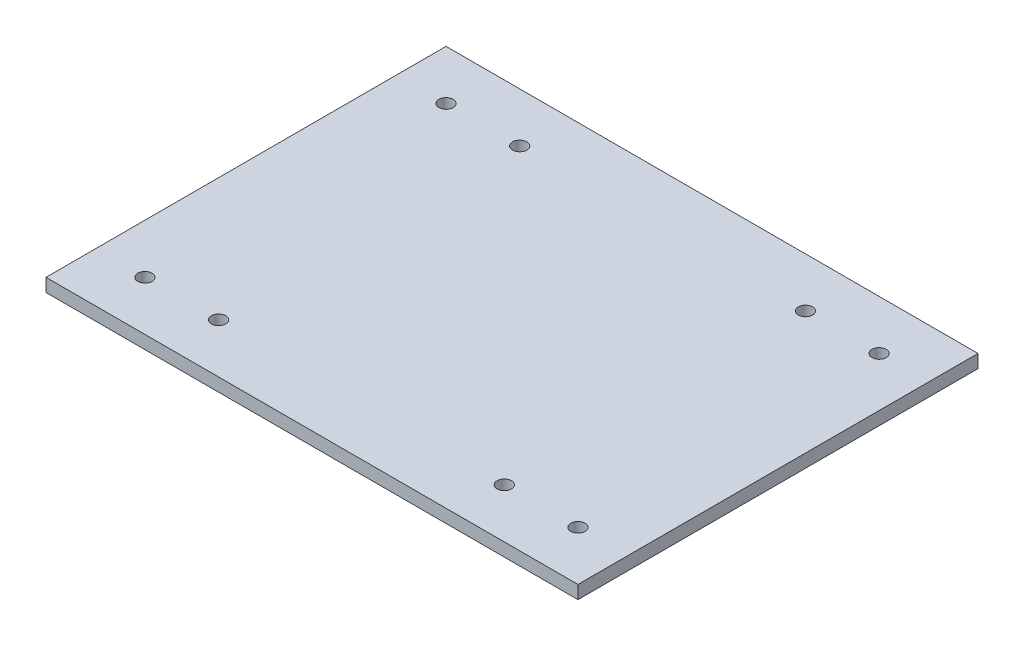
ISO-10303-21;
HEADER;
FILE_DESCRIPTION(('STEP AP214'),'2;1');
FILE_NAME('part.step','',(''),(''),'','','');
FILE_SCHEMA(('AUTOMOTIVE_DESIGN { 1 0 10303 214 1 1 1 1 }'));
ENDSEC;
DATA;
#1=APPLICATION_CONTEXT('core data for automotive mechanical design processes');
#2=APPLICATION_PROTOCOL_DEFINITION('international standard','automotive_design',2000,#1);
#3=PRODUCT_CONTEXT('',#1,'mechanical');
#4=PRODUCT('Part','Part','',(#3));
#5=PRODUCT_RELATED_PRODUCT_CATEGORY('part','',(#4));
#6=PRODUCT_DEFINITION_FORMATION('','',#4);
#7=PRODUCT_DEFINITION_CONTEXT('part definition',#1,'design');
#8=PRODUCT_DEFINITION('design','',#6,#7);
#9=PRODUCT_DEFINITION_SHAPE('','',#8);
#10=(LENGTH_UNIT() NAMED_UNIT(*) SI_UNIT(.MILLI.,.METRE.));
#11=(NAMED_UNIT(*) PLANE_ANGLE_UNIT() SI_UNIT($,.RADIAN.));
#12=(NAMED_UNIT(*) SI_UNIT($,.STERADIAN.) SOLID_ANGLE_UNIT());
#13=UNCERTAINTY_MEASURE_WITH_UNIT(LENGTH_MEASURE(1.E-05),#10,'distance_accuracy_value','');
#14=(GEOMETRIC_REPRESENTATION_CONTEXT(3) GLOBAL_UNCERTAINTY_ASSIGNED_CONTEXT((#13)) GLOBAL_UNIT_ASSIGNED_CONTEXT((#10,
#11,#12)) REPRESENTATION_CONTEXT('',''));
#15=CARTESIAN_POINT('',(0.,0.,0.));
#16=DIRECTION('',(0.,0.,1.));
#17=DIRECTION('',(1.,0.,0.));
#18=AXIS2_PLACEMENT_3D('',#15,#16,#17);
#19=CARTESIAN_POINT('',(0.,6.,0.));
#20=DIRECTION('',(0.,1.,0.));
#21=DIRECTION('',(0.,0.,1.));
#22=AXIS2_PLACEMENT_3D('',#19,#20,#21);
#23=PLANE('',#22);
#24=CARTESIAN_POINT('',(-56.,6.,-159.5));
#25=DIRECTION('',(0.,1.,0.));
#26=DIRECTION('',(0.,0.,1.));
#27=AXIS2_PLACEMENT_3D('',#24,#25,#26);
#28=CIRCLE('',#27,3.25);
#29=CARTESIAN_POINT('',(-56.,6.,-156.25));
#30=VERTEX_POINT('',#29);
#31=EDGE_CURVE('E192',#30,#30,#28,.T.);
#32=ORIENTED_EDGE('',*,*,#31,.F.);
#33=EDGE_LOOP('',(#32));
#34=FACE_BOUND('',#33,.T.);
#35=CARTESIAN_POINT('',(-56.,6.,-22.5));
#36=DIRECTION('',(0.,1.,0.));
#37=DIRECTION('',(0.,0.,1.));
#38=AXIS2_PLACEMENT_3D('',#35,#36,#37);
#39=CIRCLE('',#38,3.24999999999999);
#40=CARTESIAN_POINT('',(-56.,6.,-19.25));
#41=VERTEX_POINT('',#40);
#42=EDGE_CURVE('E176',#41,#41,#39,.T.);
#43=ORIENTED_EDGE('',*,*,#42,.F.);
#44=EDGE_LOOP('',(#43));
#45=FACE_BOUND('',#44,.T.);
#46=CARTESIAN_POINT('',(-219.5,6.,-22.5));
#47=DIRECTION('',(0.,1.,0.));
#48=DIRECTION('',(0.,0.,1.));
#49=AXIS2_PLACEMENT_3D('',#46,#47,#48);
#50=CIRCLE('',#49,3.25000000000001);
#51=CARTESIAN_POINT('',(-219.5,6.,-19.25));
#52=VERTEX_POINT('',#51);
#53=EDGE_CURVE('E133',#52,#52,#50,.T.);
#54=ORIENTED_EDGE('',*,*,#53,.F.);
#55=EDGE_LOOP('',(#54));
#56=FACE_BOUND('',#55,.T.);
#57=CARTESIAN_POINT('',(-219.5,6.,-159.5));
#58=DIRECTION('',(0.,1.,0.));
#59=DIRECTION('',(0.,0.,1.));
#60=AXIS2_PLACEMENT_3D('',#57,#58,#59);
#61=CIRCLE('',#60,3.25000000000001);
#62=CARTESIAN_POINT('',(-219.5,6.,-156.25));
#63=VERTEX_POINT('',#62);
#64=EDGE_CURVE('E134',#63,#63,#61,.T.);
#65=ORIENTED_EDGE('',*,*,#64,.F.);
#66=EDGE_LOOP('',(#65));
#67=FACE_BOUND('',#66,.T.);
#68=DIRECTION('',(0.,0.,-1.));
#69=VECTOR('',#68,1.);
#70=CARTESIAN_POINT('',(0.,6.,0.));
#71=LINE('',#70,#69);
#72=CARTESIAN_POINT('',(0.,6.,0.));
#73=VERTEX_POINT('',#72);
#74=CARTESIAN_POINT('',(0.,6.,-182.));
#75=VERTEX_POINT('',#74);
#76=EDGE_CURVE('E93',#73,#75,#71,.T.);
#77=ORIENTED_EDGE('',*,*,#76,.T.);
#78=DIRECTION('',(-1.,0.,0.));
#79=VECTOR('',#78,1.);
#80=CARTESIAN_POINT('',(0.,6.,-182.));
#81=LINE('',#80,#79);
#82=CARTESIAN_POINT('',(-242.,6.,-182.));
#83=VERTEX_POINT('',#82);
#84=EDGE_CURVE('E88',#75,#83,#81,.T.);
#85=ORIENTED_EDGE('',*,*,#84,.T.);
#86=DIRECTION('',(0.,0.,1.));
#87=VECTOR('',#86,1.);
#88=CARTESIAN_POINT('',(-242.,6.,0.));
#89=LINE('',#88,#87);
#90=CARTESIAN_POINT('',(-242.,6.,0.));
#91=VERTEX_POINT('',#90);
#92=EDGE_CURVE('E91',#83,#91,#89,.T.);
#93=ORIENTED_EDGE('',*,*,#92,.T.);
#94=DIRECTION('',(1.,0.,0.));
#95=VECTOR('',#94,1.);
#96=CARTESIAN_POINT('',(0.,6.,0.));
#97=LINE('',#96,#95);
#98=EDGE_CURVE('E58',#91,#73,#97,.T.);
#99=ORIENTED_EDGE('',*,*,#98,.T.);
#100=EDGE_LOOP('',(#77,#85,#93,#99));
#101=FACE_BOUND('',#100,.T.);
#102=CARTESIAN_POINT('',(-186.,6.,-159.5));
#103=DIRECTION('',(0.,1.,0.));
#104=DIRECTION('',(0.,0.,1.));
#105=AXIS2_PLACEMENT_3D('',#102,#103,#104);
#106=CIRCLE('',#105,3.25000000000001);
#107=CARTESIAN_POINT('',(-186.,6.,-156.25));
#108=VERTEX_POINT('',#107);
#109=EDGE_CURVE('E120',#108,#108,#106,.T.);
#110=ORIENTED_EDGE('',*,*,#109,.F.);
#111=EDGE_LOOP('',(#110));
#112=FACE_BOUND('',#111,.T.);
#113=CARTESIAN_POINT('',(-186.,6.,-22.5));
#114=DIRECTION('',(0.,1.,0.));
#115=DIRECTION('',(0.,0.,1.));
#116=AXIS2_PLACEMENT_3D('',#113,#114,#115);
#117=CIRCLE('',#116,3.25000000000001);
#118=CARTESIAN_POINT('',(-186.,6.,-19.25));
#119=VERTEX_POINT('',#118);
#120=EDGE_CURVE('E170',#119,#119,#117,.T.);
#121=ORIENTED_EDGE('',*,*,#120,.F.);
#122=EDGE_LOOP('',(#121));
#123=FACE_BOUND('',#122,.T.);
#124=CARTESIAN_POINT('',(-22.5,6.,-22.5));
#125=DIRECTION('',(0.,1.,0.));
#126=DIRECTION('',(0.,0.,1.));
#127=AXIS2_PLACEMENT_3D('',#124,#125,#126);
#128=CIRCLE('',#127,3.25);
#129=CARTESIAN_POINT('',(-22.5,6.,-19.25));
#130=VERTEX_POINT('',#129);
#131=EDGE_CURVE('E184',#130,#130,#128,.T.);
#132=ORIENTED_EDGE('',*,*,#131,.F.);
#133=EDGE_LOOP('',(#132));
#134=FACE_BOUND('',#133,.T.);
#135=CARTESIAN_POINT('',(-22.5,6.,-159.5));
#136=DIRECTION('',(0.,1.,0.));
#137=DIRECTION('',(0.,0.,1.));
#138=AXIS2_PLACEMENT_3D('',#135,#136,#137);
#139=CIRCLE('',#138,3.25);
#140=CARTESIAN_POINT('',(-22.5,6.,-156.25));
#141=VERTEX_POINT('',#140);
#142=EDGE_CURVE('E200',#141,#141,#139,.T.);
#143=ORIENTED_EDGE('',*,*,#142,.F.);
#144=EDGE_LOOP('',(#143));
#145=FACE_BOUND('',#144,.T.);
#146=ADVANCED_FACE('F40',(#34,#45,#56,#67,#101,#112,#123,#134,#145),#23,.T.);
#147=CARTESIAN_POINT('',(0.,0.,0.));
#148=DIRECTION('',(0.,1.,0.));
#149=DIRECTION('',(0.,0.,1.));
#150=AXIS2_PLACEMENT_3D('',#147,#148,#149);
#151=PLANE('',#150);
#152=DIRECTION('',(0.,0.,-1.));
#153=VECTOR('',#152,1.);
#154=CARTESIAN_POINT('',(0.,0.,0.));
#155=LINE('',#154,#153);
#156=CARTESIAN_POINT('',(0.,0.,0.));
#157=VERTEX_POINT('',#156);
#158=CARTESIAN_POINT('',(0.,0.,-182.));
#159=VERTEX_POINT('',#158);
#160=EDGE_CURVE('E139',#157,#159,#155,.T.);
#161=ORIENTED_EDGE('',*,*,#160,.F.);
#162=DIRECTION('',(1.,0.,0.));
#163=VECTOR('',#162,1.);
#164=CARTESIAN_POINT('',(0.,0.,0.));
#165=LINE('',#164,#163);
#166=CARTESIAN_POINT('',(-242.,0.,0.));
#167=VERTEX_POINT('',#166);
#168=EDGE_CURVE('E81',#167,#157,#165,.T.);
#169=ORIENTED_EDGE('',*,*,#168,.F.);
#170=DIRECTION('',(0.,0.,1.));
#171=VECTOR('',#170,1.);
#172=CARTESIAN_POINT('',(-242.,0.,0.));
#173=LINE('',#172,#171);
#174=CARTESIAN_POINT('',(-242.,0.,-182.));
#175=VERTEX_POINT('',#174);
#176=EDGE_CURVE('E75',#175,#167,#173,.T.);
#177=ORIENTED_EDGE('',*,*,#176,.F.);
#178=DIRECTION('',(-1.,0.,0.));
#179=VECTOR('',#178,1.);
#180=CARTESIAN_POINT('',(0.,0.,-182.));
#181=LINE('',#180,#179);
#182=EDGE_CURVE('E98',#159,#175,#181,.T.);
#183=ORIENTED_EDGE('',*,*,#182,.F.);
#184=EDGE_LOOP('',(#161,#169,#177,#183));
#185=FACE_BOUND('',#184,.T.);
#186=CARTESIAN_POINT('',(-219.5,0.,-159.5));
#187=DIRECTION('',(0.,1.,0.));
#188=DIRECTION('',(0.,0.,1.));
#189=AXIS2_PLACEMENT_3D('',#186,#187,#188);
#190=CIRCLE('',#189,3.25000000000001);
#191=CARTESIAN_POINT('',(-219.5,0.,-156.25));
#192=VERTEX_POINT('',#191);
#193=EDGE_CURVE('E126',#192,#192,#190,.T.);
#194=ORIENTED_EDGE('',*,*,#193,.T.);
#195=EDGE_LOOP('',(#194));
#196=FACE_BOUND('',#195,.T.);
#197=CARTESIAN_POINT('',(-186.,0.,-159.5));
#198=DIRECTION('',(0.,1.,0.));
#199=DIRECTION('',(0.,0.,1.));
#200=AXIS2_PLACEMENT_3D('',#197,#198,#199);
#201=CIRCLE('',#200,3.25000000000001);
#202=CARTESIAN_POINT('',(-186.,0.,-156.25));
#203=VERTEX_POINT('',#202);
#204=EDGE_CURVE('E127',#203,#203,#201,.T.);
#205=ORIENTED_EDGE('',*,*,#204,.T.);
#206=EDGE_LOOP('',(#205));
#207=FACE_BOUND('',#206,.T.);
#208=CARTESIAN_POINT('',(-219.5,0.,-22.5));
#209=DIRECTION('',(0.,1.,0.));
#210=DIRECTION('',(0.,0.,1.));
#211=AXIS2_PLACEMENT_3D('',#208,#209,#210);
#212=CIRCLE('',#211,3.25000000000001);
#213=CARTESIAN_POINT('',(-219.5,0.,-19.25));
#214=VERTEX_POINT('',#213);
#215=EDGE_CURVE('E128',#214,#214,#212,.T.);
#216=ORIENTED_EDGE('',*,*,#215,.T.);
#217=EDGE_LOOP('',(#216));
#218=FACE_BOUND('',#217,.T.);
#219=CARTESIAN_POINT('',(-186.,0.,-22.5));
#220=DIRECTION('',(0.,1.,0.));
#221=DIRECTION('',(0.,0.,1.));
#222=AXIS2_PLACEMENT_3D('',#219,#220,#221);
#223=CIRCLE('',#222,3.25000000000001);
#224=CARTESIAN_POINT('',(-186.,0.,-19.25));
#225=VERTEX_POINT('',#224);
#226=EDGE_CURVE('E173',#225,#225,#223,.T.);
#227=ORIENTED_EDGE('',*,*,#226,.T.);
#228=EDGE_LOOP('',(#227));
#229=FACE_BOUND('',#228,.T.);
#230=CARTESIAN_POINT('',(-56.,0.,-22.5));
#231=DIRECTION('',(0.,1.,0.));
#232=DIRECTION('',(0.,0.,1.));
#233=AXIS2_PLACEMENT_3D('',#230,#231,#232);
#234=CIRCLE('',#233,3.24999999999999);
#235=CARTESIAN_POINT('',(-56.,0.,-19.25));
#236=VERTEX_POINT('',#235);
#237=EDGE_CURVE('E180',#236,#236,#234,.T.);
#238=ORIENTED_EDGE('',*,*,#237,.T.);
#239=EDGE_LOOP('',(#238));
#240=FACE_BOUND('',#239,.T.);
#241=CARTESIAN_POINT('',(-22.5,0.,-22.5));
#242=DIRECTION('',(0.,1.,0.));
#243=DIRECTION('',(0.,0.,1.));
#244=AXIS2_PLACEMENT_3D('',#241,#242,#243);
#245=CIRCLE('',#244,3.25);
#246=CARTESIAN_POINT('',(-22.5,0.,-19.25));
#247=VERTEX_POINT('',#246);
#248=EDGE_CURVE('E188',#247,#247,#245,.T.);
#249=ORIENTED_EDGE('',*,*,#248,.T.);
#250=EDGE_LOOP('',(#249));
#251=FACE_BOUND('',#250,.T.);
#252=CARTESIAN_POINT('',(-56.,0.,-159.5));
#253=DIRECTION('',(0.,1.,0.));
#254=DIRECTION('',(0.,0.,1.));
#255=AXIS2_PLACEMENT_3D('',#252,#253,#254);
#256=CIRCLE('',#255,3.25);
#257=CARTESIAN_POINT('',(-56.,0.,-156.25));
#258=VERTEX_POINT('',#257);
#259=EDGE_CURVE('E196',#258,#258,#256,.T.);
#260=ORIENTED_EDGE('',*,*,#259,.T.);
#261=EDGE_LOOP('',(#260));
#262=FACE_BOUND('',#261,.T.);
#263=CARTESIAN_POINT('',(-22.5,0.,-159.5));
#264=DIRECTION('',(0.,1.,0.));
#265=DIRECTION('',(0.,0.,1.));
#266=AXIS2_PLACEMENT_3D('',#263,#264,#265);
#267=CIRCLE('',#266,3.25);
#268=CARTESIAN_POINT('',(-22.5,0.,-156.25));
#269=VERTEX_POINT('',#268);
#270=EDGE_CURVE('E204',#269,#269,#267,.T.);
#271=ORIENTED_EDGE('',*,*,#270,.T.);
#272=EDGE_LOOP('',(#271));
#273=FACE_BOUND('',#272,.T.);
#274=ADVANCED_FACE('F157',(#185,#196,#207,#218,#229,#240,#251,#262,#273),#151,.F.);
#275=CARTESIAN_POINT('',(0.,6.,0.));
#276=DIRECTION('',(-1.,0.,0.));
#277=DIRECTION('',(0.,0.,1.));
#278=AXIS2_PLACEMENT_3D('',#275,#276,#277);
#279=PLANE('',#278);
#280=ORIENTED_EDGE('',*,*,#160,.T.);
#281=DIRECTION('',(0.,-1.,0.));
#282=VECTOR('',#281,1.);
#283=CARTESIAN_POINT('',(0.,6.,-182.));
#284=LINE('',#283,#282);
#285=EDGE_CURVE('E12',#75,#159,#284,.T.);
#286=ORIENTED_EDGE('',*,*,#285,.F.);
#287=ORIENTED_EDGE('',*,*,#76,.F.);
#288=DIRECTION('',(0.,-1.,0.));
#289=VECTOR('',#288,1.);
#290=CARTESIAN_POINT('',(0.,6.,0.));
#291=LINE('',#290,#289);
#292=EDGE_CURVE('E105',#73,#157,#291,.T.);
#293=ORIENTED_EDGE('',*,*,#292,.T.);
#294=EDGE_LOOP('',(#280,#286,#287,#293));
#295=FACE_BOUND('',#294,.T.);
#296=ADVANCED_FACE('F42',(#295),#279,.F.);
#297=CARTESIAN_POINT('',(0.,6.,-182.));
#298=DIRECTION('',(0.,0.,1.));
#299=DIRECTION('',(1.,0.,0.));
#300=AXIS2_PLACEMENT_3D('',#297,#298,#299);
#301=PLANE('',#300);
#302=ORIENTED_EDGE('',*,*,#182,.T.);
#303=DIRECTION('',(0.,-1.,0.));
#304=VECTOR('',#303,1.);
#305=CARTESIAN_POINT('',(-242.,6.,-182.));
#306=LINE('',#305,#304);
#307=EDGE_CURVE('E50',#83,#175,#306,.T.);
#308=ORIENTED_EDGE('',*,*,#307,.F.);
#309=ORIENTED_EDGE('',*,*,#84,.F.);
#310=ORIENTED_EDGE('',*,*,#285,.T.);
#311=EDGE_LOOP('',(#302,#308,#309,#310));
#312=FACE_BOUND('',#311,.T.);
#313=ADVANCED_FACE('F97',(#312),#301,.F.);
#314=CARTESIAN_POINT('',(-242.,6.,0.));
#315=DIRECTION('',(1.,0.,0.));
#316=DIRECTION('',(0.,0.,-1.));
#317=AXIS2_PLACEMENT_3D('',#314,#315,#316);
#318=PLANE('',#317);
#319=ORIENTED_EDGE('',*,*,#176,.T.);
#320=DIRECTION('',(0.,-1.,0.));
#321=VECTOR('',#320,1.);
#322=CARTESIAN_POINT('',(-242.,6.,0.));
#323=LINE('',#322,#321);
#324=EDGE_CURVE('E100',#91,#167,#323,.T.);
#325=ORIENTED_EDGE('',*,*,#324,.F.);
#326=ORIENTED_EDGE('',*,*,#92,.F.);
#327=ORIENTED_EDGE('',*,*,#307,.T.);
#328=EDGE_LOOP('',(#319,#325,#326,#327));
#329=FACE_BOUND('',#328,.T.);
#330=ADVANCED_FACE('F101',(#329),#318,.F.);
#331=CARTESIAN_POINT('',(0.,6.,0.));
#332=DIRECTION('',(0.,0.,-1.));
#333=DIRECTION('',(-1.,0.,0.));
#334=AXIS2_PLACEMENT_3D('',#331,#332,#333);
#335=PLANE('',#334);
#336=ORIENTED_EDGE('',*,*,#168,.T.);
#337=ORIENTED_EDGE('',*,*,#292,.F.);
#338=ORIENTED_EDGE('',*,*,#98,.F.);
#339=ORIENTED_EDGE('',*,*,#324,.T.);
#340=EDGE_LOOP('',(#336,#337,#338,#339));
#341=FACE_BOUND('',#340,.T.);
#342=ADVANCED_FACE('F154',(#341),#335,.F.);
#343=CARTESIAN_POINT('',(-219.5,6.,-159.5));
#344=DIRECTION('',(0.,-1.,0.));
#345=DIRECTION('',(0.,0.,-1.));
#346=AXIS2_PLACEMENT_3D('',#343,#344,#345);
#347=CYLINDRICAL_SURFACE('',#346,3.25000000000001);
#348=ORIENTED_EDGE('',*,*,#64,.T.);
#349=EDGE_LOOP('',(#348));
#350=FACE_BOUND('',#349,.T.);
#351=ORIENTED_EDGE('',*,*,#193,.F.);
#352=EDGE_LOOP('',(#351));
#353=FACE_BOUND('',#352,.T.);
#354=ADVANCED_FACE('F238',(#350,#353),#347,.F.);
#355=CARTESIAN_POINT('',(-186.,6.,-159.5));
#356=DIRECTION('',(0.,-1.,0.));
#357=DIRECTION('',(0.,0.,-1.));
#358=AXIS2_PLACEMENT_3D('',#355,#356,#357);
#359=CYLINDRICAL_SURFACE('',#358,3.25000000000001);
#360=ORIENTED_EDGE('',*,*,#109,.T.);
#361=EDGE_LOOP('',(#360));
#362=FACE_BOUND('',#361,.T.);
#363=ORIENTED_EDGE('',*,*,#204,.F.);
#364=EDGE_LOOP('',(#363));
#365=FACE_BOUND('',#364,.T.);
#366=ADVANCED_FACE('F284',(#362,#365),#359,.F.);
#367=CARTESIAN_POINT('',(-219.5,6.,-22.5));
#368=DIRECTION('',(0.,-1.,0.));
#369=DIRECTION('',(0.,0.,-1.));
#370=AXIS2_PLACEMENT_3D('',#367,#368,#369);
#371=CYLINDRICAL_SURFACE('',#370,3.25000000000001);
#372=ORIENTED_EDGE('',*,*,#53,.T.);
#373=EDGE_LOOP('',(#372));
#374=FACE_BOUND('',#373,.T.);
#375=ORIENTED_EDGE('',*,*,#215,.F.);
#376=EDGE_LOOP('',(#375));
#377=FACE_BOUND('',#376,.T.);
#378=ADVANCED_FACE('F292',(#374,#377),#371,.F.);
#379=CARTESIAN_POINT('',(-186.,6.,-22.5));
#380=DIRECTION('',(0.,-1.,0.));
#381=DIRECTION('',(0.,0.,-1.));
#382=AXIS2_PLACEMENT_3D('',#379,#380,#381);
#383=CYLINDRICAL_SURFACE('',#382,3.25000000000001);
#384=ORIENTED_EDGE('',*,*,#120,.T.);
#385=EDGE_LOOP('',(#384));
#386=FACE_BOUND('',#385,.T.);
#387=ORIENTED_EDGE('',*,*,#226,.F.);
#388=EDGE_LOOP('',(#387));
#389=FACE_BOUND('',#388,.T.);
#390=ADVANCED_FACE('F300',(#386,#389),#383,.F.);
#391=CARTESIAN_POINT('',(-56.,6.,-22.5));
#392=DIRECTION('',(0.,-1.,0.));
#393=DIRECTION('',(0.,0.,-1.));
#394=AXIS2_PLACEMENT_3D('',#391,#392,#393);
#395=CYLINDRICAL_SURFACE('',#394,3.24999999999999);
#396=ORIENTED_EDGE('',*,*,#42,.T.);
#397=EDGE_LOOP('',(#396));
#398=FACE_BOUND('',#397,.T.);
#399=ORIENTED_EDGE('',*,*,#237,.F.);
#400=EDGE_LOOP('',(#399));
#401=FACE_BOUND('',#400,.T.);
#402=ADVANCED_FACE('F309',(#398,#401),#395,.F.);
#403=CARTESIAN_POINT('',(-22.5,6.,-22.5));
#404=DIRECTION('',(0.,-1.,0.));
#405=DIRECTION('',(0.,0.,-1.));
#406=AXIS2_PLACEMENT_3D('',#403,#404,#405);
#407=CYLINDRICAL_SURFACE('',#406,3.25);
#408=ORIENTED_EDGE('',*,*,#131,.T.);
#409=EDGE_LOOP('',(#408));
#410=FACE_BOUND('',#409,.T.);
#411=ORIENTED_EDGE('',*,*,#248,.F.);
#412=EDGE_LOOP('',(#411));
#413=FACE_BOUND('',#412,.T.);
#414=ADVANCED_FACE('F225',(#410,#413),#407,.F.);
#415=CARTESIAN_POINT('',(-56.,6.,-159.5));
#416=DIRECTION('',(0.,-1.,0.));
#417=DIRECTION('',(0.,0.,-1.));
#418=AXIS2_PLACEMENT_3D('',#415,#416,#417);
#419=CYLINDRICAL_SURFACE('',#418,3.25);
#420=ORIENTED_EDGE('',*,*,#31,.T.);
#421=EDGE_LOOP('',(#420));
#422=FACE_BOUND('',#421,.T.);
#423=ORIENTED_EDGE('',*,*,#259,.F.);
#424=EDGE_LOOP('',(#423));
#425=FACE_BOUND('',#424,.T.);
#426=ADVANCED_FACE('F219',(#422,#425),#419,.F.);
#427=CARTESIAN_POINT('',(-22.5,6.,-159.5));
#428=DIRECTION('',(0.,-1.,0.));
#429=DIRECTION('',(0.,0.,-1.));
#430=AXIS2_PLACEMENT_3D('',#427,#428,#429);
#431=CYLINDRICAL_SURFACE('',#430,3.25);
#432=ORIENTED_EDGE('',*,*,#142,.T.);
#433=EDGE_LOOP('',(#432));
#434=FACE_BOUND('',#433,.T.);
#435=ORIENTED_EDGE('',*,*,#270,.F.);
#436=EDGE_LOOP('',(#435));
#437=FACE_BOUND('',#436,.T.);
#438=ADVANCED_FACE('F217',(#434,#437),#431,.F.);
#439=CLOSED_SHELL('',(#146,#274,#296,#313,#330,#342,#354,#366,#378,#390,#402,#414,#426,#438));
#440=MANIFOLD_SOLID_BREP('B2',#439);
#441=ADVANCED_BREP_SHAPE_REPRESENTATION('',(#18,#440),#14);
#442=SHAPE_DEFINITION_REPRESENTATION(#9,#441);
ENDSEC;
END-ISO-10303-21;
